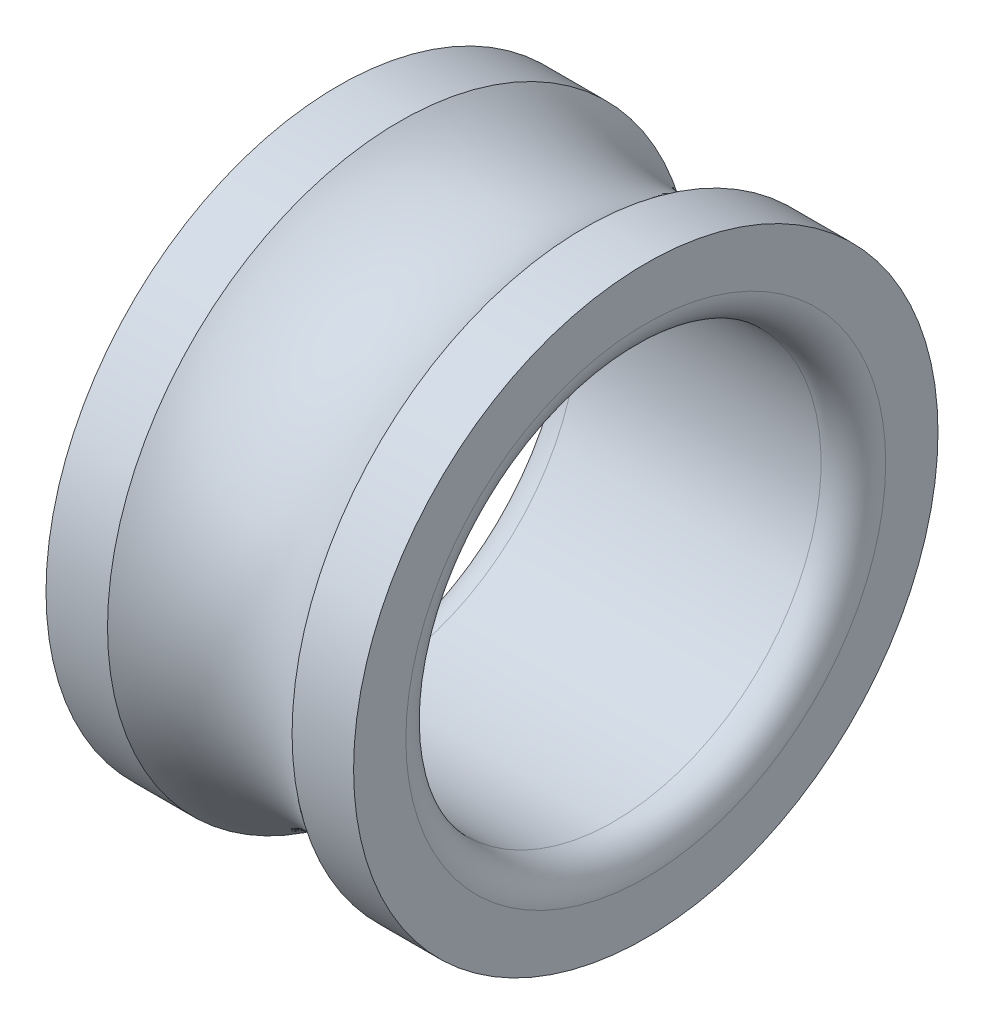
ISO-10303-21;
HEADER;
FILE_DESCRIPTION(('STEP AP214'),'2;1');
FILE_NAME('part.step','',(''),(''),'','','');
FILE_SCHEMA(('AUTOMOTIVE_DESIGN { 1 0 10303 214 1 1 1 1 }'));
ENDSEC;
DATA;
#1=APPLICATION_CONTEXT('core data for automotive mechanical design processes');
#2=APPLICATION_PROTOCOL_DEFINITION('international standard','automotive_design',2000,#1);
#3=PRODUCT_CONTEXT('',#1,'mechanical');
#4=PRODUCT('Part','Part','',(#3));
#5=PRODUCT_RELATED_PRODUCT_CATEGORY('part','',(#4));
#6=PRODUCT_DEFINITION_FORMATION('','',#4);
#7=PRODUCT_DEFINITION_CONTEXT('part definition',#1,'design');
#8=PRODUCT_DEFINITION('design','',#6,#7);
#9=PRODUCT_DEFINITION_SHAPE('','',#8);
#10=(LENGTH_UNIT() NAMED_UNIT(*) SI_UNIT(.MILLI.,.METRE.));
#11=(NAMED_UNIT(*) PLANE_ANGLE_UNIT() SI_UNIT($,.RADIAN.));
#12=(NAMED_UNIT(*) SI_UNIT($,.STERADIAN.) SOLID_ANGLE_UNIT());
#13=UNCERTAINTY_MEASURE_WITH_UNIT(LENGTH_MEASURE(1.E-05),#10,'distance_accuracy_value','');
#14=(GEOMETRIC_REPRESENTATION_CONTEXT(3) GLOBAL_UNCERTAINTY_ASSIGNED_CONTEXT((#13)) GLOBAL_UNIT_ASSIGNED_CONTEXT((#10,
#11,#12)) REPRESENTATION_CONTEXT('',''));
#15=CARTESIAN_POINT('',(0.,0.,0.));
#16=DIRECTION('',(0.,0.,1.));
#17=DIRECTION('',(1.,0.,0.));
#18=AXIS2_PLACEMENT_3D('',#15,#16,#17);
#19=CARTESIAN_POINT('',(10.,19.,0.));
#20=DIRECTION('',(-1.,0.,0.));
#21=DIRECTION('',(0.,0.,1.));
#22=AXIS2_PLACEMENT_3D('',#19,#20,#21);
#23=PLANE('',#22);
#24=CARTESIAN_POINT('',(10.,0.,0.));
#25=DIRECTION('',(-1.,0.,0.));
#26=DIRECTION('',(0.,0.,1.));
#27=AXIS2_PLACEMENT_3D('',#24,#25,#26);
#28=CIRCLE('',#27,19.);
#29=CARTESIAN_POINT('',(10.,0.,19.));
#30=VERTEX_POINT('',#29);
#31=EDGE_CURVE('E61',#30,#30,#28,.T.);
#32=ORIENTED_EDGE('',*,*,#31,.F.);
#33=EDGE_LOOP('',(#32));
#34=FACE_BOUND('',#33,.T.);
#35=CARTESIAN_POINT('',(10.,0.,0.));
#36=DIRECTION('',(-1.,0.,0.));
#37=DIRECTION('',(0.,0.,1.));
#38=AXIS2_PLACEMENT_3D('',#35,#36,#37);
#39=CIRCLE('',#38,15.6);
#40=CARTESIAN_POINT('',(10.,0.,15.6));
#41=VERTEX_POINT('',#40);
#42=EDGE_CURVE('E10',#41,#41,#39,.T.);
#43=ORIENTED_EDGE('',*,*,#42,.T.);
#44=EDGE_LOOP('',(#43));
#45=FACE_BOUND('',#44,.T.);
#46=ADVANCED_FACE('F40',(#34,#45),#23,.F.);
#47=CARTESIAN_POINT('',(7.9,0.,0.));
#48=DIRECTION('',(-1.,0.,0.));
#49=DIRECTION('',(0.,0.,1.));
#50=AXIS2_PLACEMENT_3D('',#47,#48,#49);
#51=TOROIDAL_SURFACE('',#50,15.6,2.1);
#52=ORIENTED_EDGE('',*,*,#42,.F.);
#53=EDGE_LOOP('',(#52));
#54=FACE_BOUND('',#53,.T.);
#55=CARTESIAN_POINT('',(7.9,0.,0.));
#56=DIRECTION('',(-1.,0.,0.));
#57=DIRECTION('',(0.,0.,1.));
#58=AXIS2_PLACEMENT_3D('',#55,#56,#57);
#59=CIRCLE('',#58,13.5);
#60=CARTESIAN_POINT('',(7.9,0.,13.5));
#61=VERTEX_POINT('',#60);
#62=EDGE_CURVE('E43',#61,#61,#59,.T.);
#63=ORIENTED_EDGE('',*,*,#62,.T.);
#64=EDGE_LOOP('',(#63));
#65=FACE_BOUND('',#64,.T.);
#66=ADVANCED_FACE('F75',(#54,#65),#51,.T.);
#67=CARTESIAN_POINT('',(-10.,0.,0.));
#68=DIRECTION('',(-1.,0.,0.));
#69=DIRECTION('',(0.,0.,1.));
#70=AXIS2_PLACEMENT_3D('',#67,#68,#69);
#71=CYLINDRICAL_SURFACE('',#70,13.5);
#72=ORIENTED_EDGE('',*,*,#62,.F.);
#73=EDGE_LOOP('',(#72));
#74=FACE_BOUND('',#73,.T.);
#75=CARTESIAN_POINT('',(-7.9,0.,0.));
#76=DIRECTION('',(-1.,0.,0.));
#77=DIRECTION('',(0.,0.,1.));
#78=AXIS2_PLACEMENT_3D('',#75,#76,#77);
#79=CIRCLE('',#78,13.5);
#80=CARTESIAN_POINT('',(-7.9,0.,13.5));
#81=VERTEX_POINT('',#80);
#82=EDGE_CURVE('E50',#81,#81,#79,.T.);
#83=ORIENTED_EDGE('',*,*,#82,.T.);
#84=EDGE_LOOP('',(#83));
#85=FACE_BOUND('',#84,.T.);
#86=ADVANCED_FACE('F78',(#74,#85),#71,.F.);
#87=CARTESIAN_POINT('',(-7.9,0.,0.));
#88=DIRECTION('',(-1.,0.,0.));
#89=DIRECTION('',(0.,0.,1.));
#90=AXIS2_PLACEMENT_3D('',#87,#88,#89);
#91=TOROIDAL_SURFACE('',#90,15.6,2.1);
#92=ORIENTED_EDGE('',*,*,#82,.F.);
#93=EDGE_LOOP('',(#92));
#94=FACE_BOUND('',#93,.T.);
#95=CARTESIAN_POINT('',(-9.99999999999999,0.,0.));
#96=DIRECTION('',(-1.,0.,0.));
#97=DIRECTION('',(0.,0.,1.));
#98=AXIS2_PLACEMENT_3D('',#95,#96,#97);
#99=CIRCLE('',#98,15.6);
#100=CARTESIAN_POINT('',(-9.99999999999999,0.,15.6));
#101=VERTEX_POINT('',#100);
#102=EDGE_CURVE('E51',#101,#101,#99,.T.);
#103=ORIENTED_EDGE('',*,*,#102,.T.);
#104=EDGE_LOOP('',(#103));
#105=FACE_BOUND('',#104,.T.);
#106=ADVANCED_FACE('F83',(#94,#105),#91,.T.);
#107=CARTESIAN_POINT('',(-10.,19.,0.));
#108=DIRECTION('',(1.,0.,0.));
#109=DIRECTION('',(0.,0.,-1.));
#110=AXIS2_PLACEMENT_3D('',#107,#108,#109);
#111=PLANE('',#110);
#112=ORIENTED_EDGE('',*,*,#102,.F.);
#113=EDGE_LOOP('',(#112));
#114=FACE_BOUND('',#113,.T.);
#115=CARTESIAN_POINT('',(-10.,0.,0.));
#116=DIRECTION('',(-1.,0.,0.));
#117=DIRECTION('',(0.,0.,1.));
#118=AXIS2_PLACEMENT_3D('',#115,#116,#117);
#119=CIRCLE('',#118,19.);
#120=CARTESIAN_POINT('',(-10.,0.,19.));
#121=VERTEX_POINT('',#120);
#122=EDGE_CURVE('E57',#121,#121,#119,.T.);
#123=ORIENTED_EDGE('',*,*,#122,.T.);
#124=EDGE_LOOP('',(#123));
#125=FACE_BOUND('',#124,.T.);
#126=ADVANCED_FACE('F90',(#114,#125),#111,.F.);
#127=CARTESIAN_POINT('',(-10.,0.,0.));
#128=DIRECTION('',(-1.,0.,0.));
#129=DIRECTION('',(0.,0.,1.));
#130=AXIS2_PLACEMENT_3D('',#127,#128,#129);
#131=CYLINDRICAL_SURFACE('',#130,19.);
#132=ORIENTED_EDGE('',*,*,#122,.F.);
#133=EDGE_LOOP('',(#132));
#134=FACE_BOUND('',#133,.T.);
#135=CARTESIAN_POINT('',(-5.99999999999999,0.,0.));
#136=DIRECTION('',(-1.,0.,0.));
#137=DIRECTION('',(0.,0.,1.));
#138=AXIS2_PLACEMENT_3D('',#135,#136,#137);
#139=CIRCLE('',#138,19.);
#140=CARTESIAN_POINT('',(-5.99999999999999,0.,19.));
#141=VERTEX_POINT('',#140);
#142=EDGE_CURVE('E56',#141,#141,#139,.T.);
#143=ORIENTED_EDGE('',*,*,#142,.T.);
#144=EDGE_LOOP('',(#143));
#145=FACE_BOUND('',#144,.T.);
#146=ADVANCED_FACE('F91',(#134,#145),#131,.T.);
#147=CARTESIAN_POINT('',(0.,0.,0.));
#148=DIRECTION('',(-1.,0.,0.));
#149=DIRECTION('',(0.,0.,1.));
#150=AXIS2_PLACEMENT_3D('',#147,#148,#149);
#151=TOROIDAL_SURFACE('',#150,27.,10.);
#152=ORIENTED_EDGE('',*,*,#142,.F.);
#153=EDGE_LOOP('',(#152));
#154=FACE_BOUND('',#153,.T.);
#155=CARTESIAN_POINT('',(5.99999999999999,0.,0.));
#156=DIRECTION('',(-1.,0.,0.));
#157=DIRECTION('',(0.,0.,1.));
#158=AXIS2_PLACEMENT_3D('',#155,#156,#157);
#159=CIRCLE('',#158,19.);
#160=CARTESIAN_POINT('',(5.99999999999999,0.,19.));
#161=VERTEX_POINT('',#160);
#162=EDGE_CURVE('E65',#161,#161,#159,.T.);
#163=ORIENTED_EDGE('',*,*,#162,.T.);
#164=EDGE_LOOP('',(#163));
#165=FACE_BOUND('',#164,.T.);
#166=ADVANCED_FACE('F94',(#154,#165),#151,.F.);
#167=CARTESIAN_POINT('',(-10.,0.,0.));
#168=DIRECTION('',(-1.,0.,0.));
#169=DIRECTION('',(0.,0.,1.));
#170=AXIS2_PLACEMENT_3D('',#167,#168,#169);
#171=CYLINDRICAL_SURFACE('',#170,19.);
#172=ORIENTED_EDGE('',*,*,#162,.F.);
#173=EDGE_LOOP('',(#172));
#174=FACE_BOUND('',#173,.T.);
#175=ORIENTED_EDGE('',*,*,#31,.T.);
#176=EDGE_LOOP('',(#175));
#177=FACE_BOUND('',#176,.T.);
#178=ADVANCED_FACE('F69',(#174,#177),#171,.T.);
#179=CLOSED_SHELL('',(#46,#66,#86,#106,#126,#146,#166,#178));
#180=MANIFOLD_SOLID_BREP('B2',#179);
#181=ADVANCED_BREP_SHAPE_REPRESENTATION('',(#18,#180),#14);
#182=SHAPE_DEFINITION_REPRESENTATION(#9,#181);
ENDSEC;
END-ISO-10303-21;
